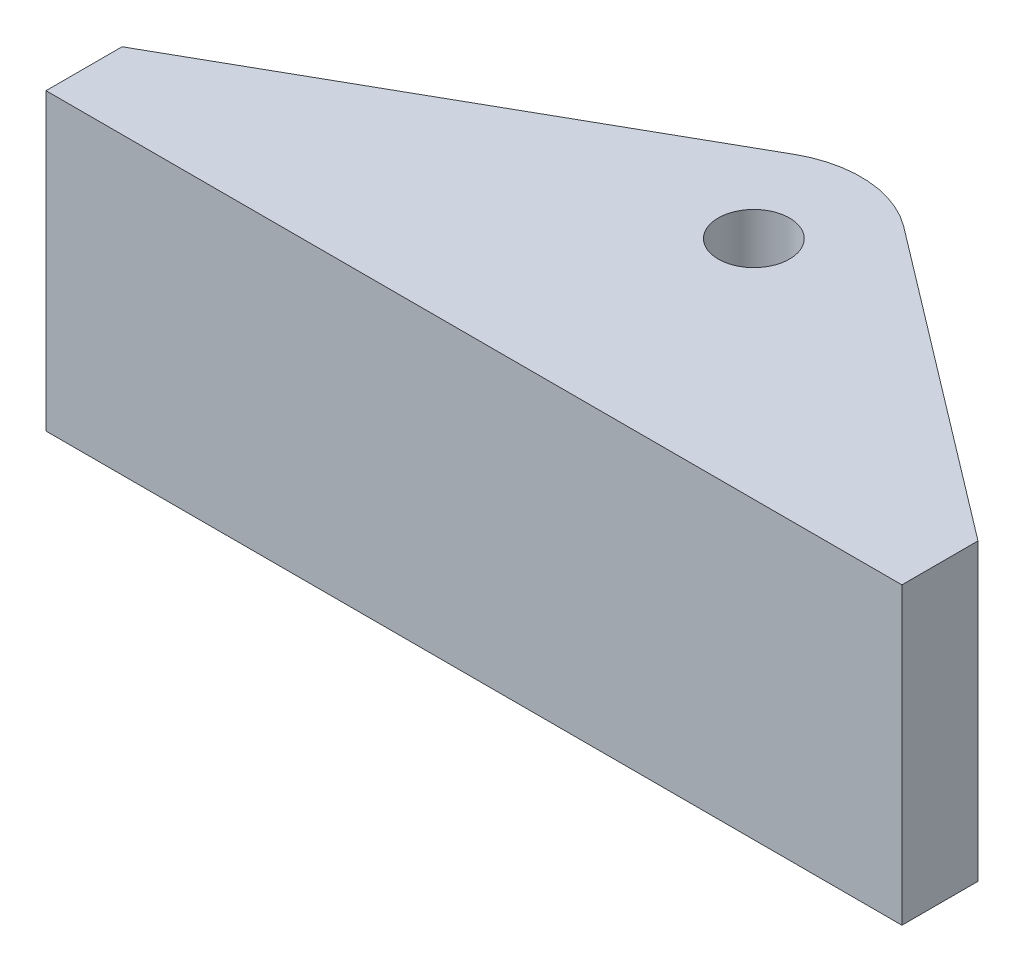
ISO-10303-21;
HEADER;
FILE_DESCRIPTION(('STEP AP214'),'2;1');
FILE_NAME('part.step','',(''),(''),'','','');
FILE_SCHEMA(('AUTOMOTIVE_DESIGN { 1 0 10303 214 1 1 1 1 }'));
ENDSEC;
DATA;
#1=APPLICATION_CONTEXT('core data for automotive mechanical design processes');
#2=APPLICATION_PROTOCOL_DEFINITION('international standard','automotive_design',2000,#1);
#3=PRODUCT_CONTEXT('',#1,'mechanical');
#4=PRODUCT('Part','Part','',(#3));
#5=PRODUCT_RELATED_PRODUCT_CATEGORY('part','',(#4));
#6=PRODUCT_DEFINITION_FORMATION('','',#4);
#7=PRODUCT_DEFINITION_CONTEXT('part definition',#1,'design');
#8=PRODUCT_DEFINITION('design','',#6,#7);
#9=PRODUCT_DEFINITION_SHAPE('','',#8);
#10=(LENGTH_UNIT() NAMED_UNIT(*) SI_UNIT(.MILLI.,.METRE.));
#11=(NAMED_UNIT(*) PLANE_ANGLE_UNIT() SI_UNIT($,.RADIAN.));
#12=(NAMED_UNIT(*) SI_UNIT($,.STERADIAN.) SOLID_ANGLE_UNIT());
#13=UNCERTAINTY_MEASURE_WITH_UNIT(LENGTH_MEASURE(1.E-05),#10,'distance_accuracy_value','');
#14=(GEOMETRIC_REPRESENTATION_CONTEXT(3) GLOBAL_UNCERTAINTY_ASSIGNED_CONTEXT((#13)) GLOBAL_UNIT_ASSIGNED_CONTEXT((#10,
#11,#12)) REPRESENTATION_CONTEXT('',''));
#15=CARTESIAN_POINT('',(0.,0.,0.));
#16=DIRECTION('',(0.,0.,1.));
#17=DIRECTION('',(1.,0.,0.));
#18=AXIS2_PLACEMENT_3D('',#15,#16,#17);
#19=CARTESIAN_POINT('',(0.,-19.685,0.));
#20=DIRECTION('',(-1.,0.,0.));
#21=DIRECTION('',(0.,0.,1.));
#22=AXIS2_PLACEMENT_3D('',#19,#20,#21);
#23=PLANE('',#22);
#24=DIRECTION('',(0.,0.,1.));
#25=VECTOR('',#24,1.);
#26=CARTESIAN_POINT('',(0.,0.,0.));
#27=LINE('',#26,#25);
#28=CARTESIAN_POINT('',(0.,0.,-5.08));
#29=VERTEX_POINT('',#28);
#30=CARTESIAN_POINT('',(0.,0.,0.));
#31=VERTEX_POINT('',#30);
#32=EDGE_CURVE('E136',#29,#31,#27,.T.);
#33=ORIENTED_EDGE('',*,*,#32,.F.);
#34=DIRECTION('',(0.,1.,0.));
#35=VECTOR('',#34,1.);
#36=CARTESIAN_POINT('',(0.,-19.685,-5.08));
#37=LINE('',#36,#35);
#38=CARTESIAN_POINT('',(0.,-19.685,-5.08));
#39=VERTEX_POINT('',#38);
#40=EDGE_CURVE('E11',#39,#29,#37,.T.);
#41=ORIENTED_EDGE('',*,*,#40,.F.);
#42=DIRECTION('',(0.,0.,1.));
#43=VECTOR('',#42,1.);
#44=CARTESIAN_POINT('',(0.,-19.685,0.));
#45=LINE('',#44,#43);
#46=CARTESIAN_POINT('',(0.,-19.685,0.));
#47=VERTEX_POINT('',#46);
#48=EDGE_CURVE('E157',#39,#47,#45,.T.);
#49=ORIENTED_EDGE('',*,*,#48,.T.);
#50=DIRECTION('',(0.,1.,0.));
#51=VECTOR('',#50,1.);
#52=CARTESIAN_POINT('',(0.,-19.685,0.));
#53=LINE('',#52,#51);
#54=EDGE_CURVE('E48',#47,#31,#53,.T.);
#55=ORIENTED_EDGE('',*,*,#54,.T.);
#56=EDGE_LOOP('',(#33,#41,#49,#55));
#57=FACE_BOUND('',#56,.T.);
#58=ADVANCED_FACE('F45',(#57),#23,.T.);
#59=CARTESIAN_POINT('',(0.,-19.685,-5.08));
#60=DIRECTION('',(-0.492458400486314,0.,-0.870335983279137));
#61=DIRECTION('',(-0.870335983279136,0.,0.492458400486314));
#62=AXIS2_PLACEMENT_3D('',#59,#60,#61);
#63=PLANE('',#62);
#64=DIRECTION('',(-0.870335983279136,0.,0.492458400486314));
#65=VECTOR('',#64,1.);
#66=CARTESIAN_POINT('',(0.,0.,-5.08));
#67=LINE('',#66,#65);
#68=CARTESIAN_POINT('',(28.6638003015259,0.,-21.2987126805503));
#69=VERTEX_POINT('',#68);
#70=EDGE_CURVE('E154',#69,#29,#67,.T.);
#71=ORIENTED_EDGE('',*,*,#70,.F.);
#72=DIRECTION('',(0.,1.,0.));
#73=VECTOR('',#72,1.);
#74=CARTESIAN_POINT('',(28.6638003015259,-19.685,-21.2987126805503));
#75=LINE('',#74,#73);
#76=CARTESIAN_POINT('',(28.6638003015259,-19.685,-21.2987126805503));
#77=VERTEX_POINT('',#76);
#78=EDGE_CURVE('E55',#77,#69,#75,.T.);
#79=ORIENTED_EDGE('',*,*,#78,.F.);
#80=DIRECTION('',(-0.870335983279136,0.,0.492458400486314));
#81=VECTOR('',#80,1.);
#82=CARTESIAN_POINT('',(0.,-19.685,-5.08));
#83=LINE('',#82,#81);
#84=EDGE_CURVE('E122',#77,#39,#83,.T.);
#85=ORIENTED_EDGE('',*,*,#84,.T.);
#86=ORIENTED_EDGE('',*,*,#40,.T.);
#87=EDGE_LOOP('',(#71,#79,#85,#86));
#88=FACE_BOUND('',#87,.T.);
#89=ADVANCED_FACE('F169',(#88),#63,.T.);
#90=CARTESIAN_POINT('',(32.1818,-19.685,-15.08125));
#91=DIRECTION('',(0.,1.,0.));
#92=DIRECTION('',(0.,0.,1.));
#93=AXIS2_PLACEMENT_3D('',#90,#91,#92);
#94=CYLINDRICAL_SURFACE('',#93,7.14375000000001);
#95=CARTESIAN_POINT('',(32.1818,0.,-15.08125));
#96=DIRECTION('',(0.,1.,0.));
#97=DIRECTION('',(0.,0.,1.));
#98=AXIS2_PLACEMENT_3D('',#95,#96,#97);
#99=CIRCLE('',#98,7.14375000000001);
#100=CARTESIAN_POINT('',(36.5040405214129,0.,-20.7690791937748));
#101=VERTEX_POINT('',#100);
#102=EDGE_CURVE('E108',#101,#69,#99,.T.);
#103=ORIENTED_EDGE('',*,*,#102,.F.);
#104=DIRECTION('',(0.,1.,0.));
#105=VECTOR('',#104,1.);
#106=CARTESIAN_POINT('',(36.5040405214129,-19.685,-20.7690791937748));
#107=LINE('',#106,#105);
#108=CARTESIAN_POINT('',(36.5040405214129,-19.685,-20.7690791937748));
#109=VERTEX_POINT('',#108);
#110=EDGE_CURVE('E103',#109,#101,#107,.T.);
#111=ORIENTED_EDGE('',*,*,#110,.F.);
#112=CARTESIAN_POINT('',(32.1818,-19.685,-15.08125));
#113=DIRECTION('',(0.,1.,0.));
#114=DIRECTION('',(0.,0.,1.));
#115=AXIS2_PLACEMENT_3D('',#112,#113,#114);
#116=CIRCLE('',#115,7.14375000000001);
#117=EDGE_CURVE('E106',#109,#77,#116,.T.);
#118=ORIENTED_EDGE('',*,*,#117,.T.);
#119=ORIENTED_EDGE('',*,*,#78,.T.);
#120=EDGE_LOOP('',(#103,#111,#118,#119));
#121=FACE_BOUND('',#120,.T.);
#122=ADVANCED_FACE('F105',(#121),#94,.T.);
#123=CARTESIAN_POINT('',(57.15,-19.685,-5.08));
#124=DIRECTION('',(0.605038043242393,0.,-0.796196562558151));
#125=DIRECTION('',(-0.796196562558151,0.,-0.605038043242393));
#126=AXIS2_PLACEMENT_3D('',#123,#124,#125);
#127=PLANE('',#126);
#128=DIRECTION('',(-0.796196562558151,0.,-0.605038043242393));
#129=VECTOR('',#128,1.);
#130=CARTESIAN_POINT('',(57.15,0.,-5.08));
#131=LINE('',#130,#129);
#132=CARTESIAN_POINT('',(57.15,0.,-5.08));
#133=VERTEX_POINT('',#132);
#134=EDGE_CURVE('E149',#133,#101,#131,.T.);
#135=ORIENTED_EDGE('',*,*,#134,.F.);
#136=DIRECTION('',(0.,1.,0.));
#137=VECTOR('',#136,1.);
#138=CARTESIAN_POINT('',(57.15,-19.685,-5.08));
#139=LINE('',#138,#137);
#140=CARTESIAN_POINT('',(57.15,-19.685,-5.08));
#141=VERTEX_POINT('',#140);
#142=EDGE_CURVE('E114',#141,#133,#139,.T.);
#143=ORIENTED_EDGE('',*,*,#142,.F.);
#144=DIRECTION('',(-0.796196562558151,0.,-0.605038043242393));
#145=VECTOR('',#144,1.);
#146=CARTESIAN_POINT('',(57.15,-19.685,-5.08));
#147=LINE('',#146,#145);
#148=EDGE_CURVE('E120',#141,#109,#147,.T.);
#149=ORIENTED_EDGE('',*,*,#148,.T.);
#150=ORIENTED_EDGE('',*,*,#110,.T.);
#151=EDGE_LOOP('',(#135,#143,#149,#150));
#152=FACE_BOUND('',#151,.T.);
#153=ADVANCED_FACE('F125',(#152),#127,.T.);
#154=CARTESIAN_POINT('',(57.15,-19.685,0.));
#155=DIRECTION('',(1.,0.,0.));
#156=DIRECTION('',(0.,0.,-1.));
#157=AXIS2_PLACEMENT_3D('',#154,#155,#156);
#158=PLANE('',#157);
#159=DIRECTION('',(0.,0.,-1.));
#160=VECTOR('',#159,1.);
#161=CARTESIAN_POINT('',(57.15,0.,0.));
#162=LINE('',#161,#160);
#163=CARTESIAN_POINT('',(57.15,0.,0.));
#164=VERTEX_POINT('',#163);
#165=EDGE_CURVE('E145',#164,#133,#162,.T.);
#166=ORIENTED_EDGE('',*,*,#165,.F.);
#167=DIRECTION('',(0.,1.,0.));
#168=VECTOR('',#167,1.);
#169=CARTESIAN_POINT('',(57.15,-19.685,0.));
#170=LINE('',#169,#168);
#171=CARTESIAN_POINT('',(57.15,-19.685,0.));
#172=VERTEX_POINT('',#171);
#173=EDGE_CURVE('E162',#172,#164,#170,.T.);
#174=ORIENTED_EDGE('',*,*,#173,.F.);
#175=DIRECTION('',(0.,0.,-1.));
#176=VECTOR('',#175,1.);
#177=CARTESIAN_POINT('',(57.15,-19.685,0.));
#178=LINE('',#177,#176);
#179=EDGE_CURVE('E127',#172,#141,#178,.T.);
#180=ORIENTED_EDGE('',*,*,#179,.T.);
#181=ORIENTED_EDGE('',*,*,#142,.T.);
#182=EDGE_LOOP('',(#166,#174,#180,#181));
#183=FACE_BOUND('',#182,.T.);
#184=ADVANCED_FACE('F182',(#183),#158,.T.);
#185=CARTESIAN_POINT('',(0.,-19.685,0.));
#186=DIRECTION('',(0.,0.,1.));
#187=DIRECTION('',(1.,0.,0.));
#188=AXIS2_PLACEMENT_3D('',#185,#186,#187);
#189=PLANE('',#188);
#190=DIRECTION('',(1.,0.,0.));
#191=VECTOR('',#190,1.);
#192=CARTESIAN_POINT('',(0.,0.,0.));
#193=LINE('',#192,#191);
#194=EDGE_CURVE('E140',#31,#164,#193,.T.);
#195=ORIENTED_EDGE('',*,*,#194,.F.);
#196=ORIENTED_EDGE('',*,*,#54,.F.);
#197=DIRECTION('',(1.,0.,0.));
#198=VECTOR('',#197,1.);
#199=CARTESIAN_POINT('',(0.,-19.685,0.));
#200=LINE('',#199,#198);
#201=EDGE_CURVE('E130',#47,#172,#200,.T.);
#202=ORIENTED_EDGE('',*,*,#201,.T.);
#203=ORIENTED_EDGE('',*,*,#173,.T.);
#204=EDGE_LOOP('',(#195,#196,#202,#203));
#205=FACE_BOUND('',#204,.T.);
#206=ADVANCED_FACE('F166',(#205),#189,.T.);
#207=CARTESIAN_POINT('',(32.1818,-19.685,-15.08125));
#208=DIRECTION('',(0.,1.,0.));
#209=DIRECTION('',(0.,0.,1.));
#210=AXIS2_PLACEMENT_3D('',#207,#208,#209);
#211=PLANE('',#210);
#212=CARTESIAN_POINT('',(32.1818,-19.685,-15.08125));
#213=DIRECTION('',(0.,1.,0.));
#214=DIRECTION('',(0.,0.,1.));
#215=AXIS2_PLACEMENT_3D('',#212,#213,#214);
#216=CIRCLE('',#215,2.38125);
#217=CARTESIAN_POINT('',(32.1818,-19.685,-12.7));
#218=VERTEX_POINT('',#217);
#219=EDGE_CURVE('E141',#218,#218,#216,.T.);
#220=ORIENTED_EDGE('',*,*,#219,.T.);
#221=EDGE_LOOP('',(#220));
#222=FACE_BOUND('',#221,.T.);
#223=ORIENTED_EDGE('',*,*,#48,.F.);
#224=ORIENTED_EDGE('',*,*,#84,.F.);
#225=ORIENTED_EDGE('',*,*,#117,.F.);
#226=ORIENTED_EDGE('',*,*,#148,.F.);
#227=ORIENTED_EDGE('',*,*,#179,.F.);
#228=ORIENTED_EDGE('',*,*,#201,.F.);
#229=EDGE_LOOP('',(#223,#224,#225,#226,#227,#228));
#230=FACE_BOUND('',#229,.T.);
#231=ADVANCED_FACE('F118',(#222,#230),#211,.F.);
#232=CARTESIAN_POINT('',(32.1818,0.,-15.08125));
#233=DIRECTION('',(0.,1.,0.));
#234=DIRECTION('',(0.,0.,1.));
#235=AXIS2_PLACEMENT_3D('',#232,#233,#234);
#236=PLANE('',#235);
#237=CARTESIAN_POINT('',(32.1818,0.,-15.08125));
#238=DIRECTION('',(0.,1.,0.));
#239=DIRECTION('',(0.,0.,1.));
#240=AXIS2_PLACEMENT_3D('',#237,#238,#239);
#241=CIRCLE('',#240,2.38125);
#242=CARTESIAN_POINT('',(32.1818,0.,-12.7));
#243=VERTEX_POINT('',#242);
#244=EDGE_CURVE('E205',#243,#243,#241,.T.);
#245=ORIENTED_EDGE('',*,*,#244,.F.);
#246=EDGE_LOOP('',(#245));
#247=FACE_BOUND('',#246,.T.);
#248=ORIENTED_EDGE('',*,*,#32,.T.);
#249=ORIENTED_EDGE('',*,*,#194,.T.);
#250=ORIENTED_EDGE('',*,*,#165,.T.);
#251=ORIENTED_EDGE('',*,*,#134,.T.);
#252=ORIENTED_EDGE('',*,*,#102,.T.);
#253=ORIENTED_EDGE('',*,*,#70,.T.);
#254=EDGE_LOOP('',(#248,#249,#250,#251,#252,#253));
#255=FACE_BOUND('',#254,.T.);
#256=ADVANCED_FACE('F168',(#247,#255),#236,.T.);
#257=CARTESIAN_POINT('',(32.1818,-19.685,-15.08125));
#258=DIRECTION('',(0.,1.,0.));
#259=DIRECTION('',(0.,0.,1.));
#260=AXIS2_PLACEMENT_3D('',#257,#258,#259);
#261=CYLINDRICAL_SURFACE('',#260,2.38125);
#262=ORIENTED_EDGE('',*,*,#219,.F.);
#263=EDGE_LOOP('',(#262));
#264=FACE_BOUND('',#263,.T.);
#265=ORIENTED_EDGE('',*,*,#244,.T.);
#266=EDGE_LOOP('',(#265));
#267=FACE_BOUND('',#266,.T.);
#268=ADVANCED_FACE('F193',(#264,#267),#261,.F.);
#269=CLOSED_SHELL('',(#58,#89,#122,#153,#184,#206,#231,#256,#268));
#270=MANIFOLD_SOLID_BREP('B2',#269);
#271=ADVANCED_BREP_SHAPE_REPRESENTATION('',(#18,#270),#14);
#272=SHAPE_DEFINITION_REPRESENTATION(#9,#271);
ENDSEC;
END-ISO-10303-21;
